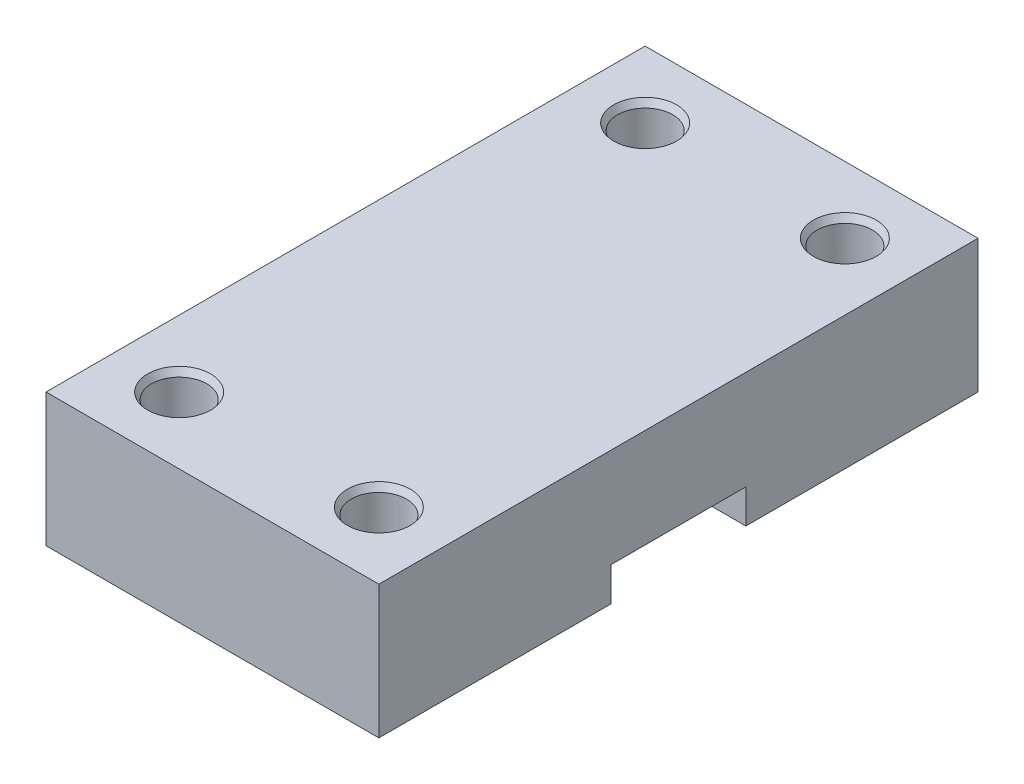
ISO-10303-21;
HEADER;
FILE_DESCRIPTION(('STEP AP214'),'2;1');
FILE_NAME('part.step','',(''),(''),'','','');
FILE_SCHEMA(('AUTOMOTIVE_DESIGN { 1 0 10303 214 1 1 1 1 }'));
ENDSEC;
DATA;
#1=APPLICATION_CONTEXT('core data for automotive mechanical design processes');
#2=APPLICATION_PROTOCOL_DEFINITION('international standard','automotive_design',2000,#1);
#3=PRODUCT_CONTEXT('',#1,'mechanical');
#4=PRODUCT('Part','Part','',(#3));
#5=PRODUCT_RELATED_PRODUCT_CATEGORY('part','',(#4));
#6=PRODUCT_DEFINITION_FORMATION('','',#4);
#7=PRODUCT_DEFINITION_CONTEXT('part definition',#1,'design');
#8=PRODUCT_DEFINITION('design','',#6,#7);
#9=PRODUCT_DEFINITION_SHAPE('','',#8);
#10=(LENGTH_UNIT() NAMED_UNIT(*) SI_UNIT(.MILLI.,.METRE.));
#11=(NAMED_UNIT(*) PLANE_ANGLE_UNIT() SI_UNIT($,.RADIAN.));
#12=(NAMED_UNIT(*) SI_UNIT($,.STERADIAN.) SOLID_ANGLE_UNIT());
#13=UNCERTAINTY_MEASURE_WITH_UNIT(LENGTH_MEASURE(1.E-05),#10,'distance_accuracy_value','');
#14=(GEOMETRIC_REPRESENTATION_CONTEXT(3) GLOBAL_UNCERTAINTY_ASSIGNED_CONTEXT((#13)) GLOBAL_UNIT_ASSIGNED_CONTEXT((#10,
#11,#12)) REPRESENTATION_CONTEXT('',''));
#15=CARTESIAN_POINT('',(0.,0.,0.));
#16=DIRECTION('',(0.,0.,1.));
#17=DIRECTION('',(1.,0.,0.));
#18=AXIS2_PLACEMENT_3D('',#15,#16,#17);
#19=CARTESIAN_POINT('',(0.,0.,0.));
#20=DIRECTION('',(0.,1.,0.));
#21=DIRECTION('',(0.,0.,1.));
#22=AXIS2_PLACEMENT_3D('',#19,#20,#21);
#23=PLANE('',#22);
#24=CARTESIAN_POINT('',(15.,0.,35.));
#25=DIRECTION('',(0.,-1.,0.));
#26=DIRECTION('',(0.,0.,-1.));
#27=AXIS2_PLACEMENT_3D('',#24,#25,#26);
#28=CIRCLE('',#27,4.15);
#29=CARTESIAN_POINT('',(15.,0.,30.85));
#30=VERTEX_POINT('',#29);
#31=EDGE_CURVE('E218',#30,#30,#28,.T.);
#32=ORIENTED_EDGE('',*,*,#31,.F.);
#33=EDGE_LOOP('',(#32));
#34=FACE_BOUND('',#33,.T.);
#35=CARTESIAN_POINT('',(-15.,0.,35.));
#36=DIRECTION('',(0.,-1.,0.));
#37=DIRECTION('',(0.,0.,-1.));
#38=AXIS2_PLACEMENT_3D('',#35,#36,#37);
#39=CIRCLE('',#38,4.15);
#40=CARTESIAN_POINT('',(-15.,0.,30.85));
#41=VERTEX_POINT('',#40);
#42=EDGE_CURVE('E130',#41,#41,#39,.T.);
#43=ORIENTED_EDGE('',*,*,#42,.F.);
#44=EDGE_LOOP('',(#43));
#45=FACE_BOUND('',#44,.T.);
#46=DIRECTION('',(0.,0.,1.));
#47=VECTOR('',#46,1.);
#48=CARTESIAN_POINT('',(-25.,0.,45.));
#49=LINE('',#48,#47);
#50=CARTESIAN_POINT('',(-25.,0.,10.125));
#51=VERTEX_POINT('',#50);
#52=CARTESIAN_POINT('',(-25.,0.,45.));
#53=VERTEX_POINT('',#52);
#54=EDGE_CURVE('E127',#51,#53,#49,.T.);
#55=ORIENTED_EDGE('',*,*,#54,.F.);
#56=DIRECTION('',(1.,0.,0.));
#57=VECTOR('',#56,1.);
#58=CARTESIAN_POINT('',(-25.,0.,10.125));
#59=LINE('',#58,#57);
#60=CARTESIAN_POINT('',(25.,0.,10.125));
#61=VERTEX_POINT('',#60);
#62=EDGE_CURVE('E109',#51,#61,#59,.T.);
#63=ORIENTED_EDGE('',*,*,#62,.T.);
#64=DIRECTION('',(0.,0.,-1.));
#65=VECTOR('',#64,1.);
#66=CARTESIAN_POINT('',(25.,0.,45.));
#67=LINE('',#66,#65);
#68=CARTESIAN_POINT('',(25.,0.,45.));
#69=VERTEX_POINT('',#68);
#70=EDGE_CURVE('E143',#69,#61,#67,.T.);
#71=ORIENTED_EDGE('',*,*,#70,.F.);
#72=DIRECTION('',(1.,0.,0.));
#73=VECTOR('',#72,1.);
#74=CARTESIAN_POINT('',(25.,0.,45.));
#75=LINE('',#74,#73);
#76=EDGE_CURVE('E132',#53,#69,#75,.T.);
#77=ORIENTED_EDGE('',*,*,#76,.F.);
#78=EDGE_LOOP('',(#55,#63,#71,#77));
#79=FACE_BOUND('',#78,.T.);
#80=ADVANCED_FACE('F34',(#34,#45,#79),#23,.F.);
#81=CARTESIAN_POINT('',(-25.,20.,45.));
#82=DIRECTION('',(1.,0.,0.));
#83=DIRECTION('',(0.,0.,-1.));
#84=AXIS2_PLACEMENT_3D('',#81,#82,#83);
#85=PLANE('',#84);
#86=DIRECTION('',(0.,0.,1.));
#87=VECTOR('',#86,1.);
#88=CARTESIAN_POINT('',(-25.,5.10000000000001,-10.125));
#89=LINE('',#88,#87);
#90=CARTESIAN_POINT('',(-25.,5.10000000000001,-10.125));
#91=VERTEX_POINT('',#90);
#92=CARTESIAN_POINT('',(-25.,5.1,10.125));
#93=VERTEX_POINT('',#92);
#94=EDGE_CURVE('E122',#91,#93,#89,.T.);
#95=ORIENTED_EDGE('',*,*,#94,.T.);
#96=DIRECTION('',(0.,-1.,0.));
#97=VECTOR('',#96,1.);
#98=CARTESIAN_POINT('',(-25.,5.1,10.125));
#99=LINE('',#98,#97);
#100=EDGE_CURVE('E113',#93,#51,#99,.T.);
#101=ORIENTED_EDGE('',*,*,#100,.T.);
#102=ORIENTED_EDGE('',*,*,#54,.T.);
#103=DIRECTION('',(0.,-1.,0.));
#104=VECTOR('',#103,1.);
#105=CARTESIAN_POINT('',(-25.,20.,45.));
#106=LINE('',#105,#104);
#107=CARTESIAN_POINT('',(-25.,20.,45.));
#108=VERTEX_POINT('',#107);
#109=EDGE_CURVE('E154',#108,#53,#106,.T.);
#110=ORIENTED_EDGE('',*,*,#109,.F.);
#111=DIRECTION('',(0.,0.,1.));
#112=VECTOR('',#111,1.);
#113=CARTESIAN_POINT('',(-25.,20.,45.));
#114=LINE('',#113,#112);
#115=CARTESIAN_POINT('',(-25.,20.,-45.));
#116=VERTEX_POINT('',#115);
#117=EDGE_CURVE('E146',#116,#108,#114,.T.);
#118=ORIENTED_EDGE('',*,*,#117,.F.);
#119=DIRECTION('',(0.,-1.,0.));
#120=VECTOR('',#119,1.);
#121=CARTESIAN_POINT('',(-25.,20.,-45.));
#122=LINE('',#121,#120);
#123=CARTESIAN_POINT('',(-25.,0.,-45.));
#124=VERTEX_POINT('',#123);
#125=EDGE_CURVE('E147',#116,#124,#122,.T.);
#126=ORIENTED_EDGE('',*,*,#125,.T.);
#127=CARTESIAN_POINT('',(-25.,0.,-10.125));
#128=VERTEX_POINT('',#127);
#129=EDGE_CURVE('E133',#124,#128,#49,.T.);
#130=ORIENTED_EDGE('',*,*,#129,.T.);
#131=DIRECTION('',(0.,1.,0.));
#132=VECTOR('',#131,1.);
#133=CARTESIAN_POINT('',(-25.,5.10000000000001,-10.125));
#134=LINE('',#133,#132);
#135=EDGE_CURVE('E49',#128,#91,#134,.T.);
#136=ORIENTED_EDGE('',*,*,#135,.T.);
#137=EDGE_LOOP('',(#95,#101,#102,#110,#118,#126,#130,#136));
#138=FACE_BOUND('',#137,.T.);
#139=ADVANCED_FACE('F125',(#138),#85,.F.);
#140=CARTESIAN_POINT('',(25.,20.,45.));
#141=DIRECTION('',(0.,0.,-1.));
#142=DIRECTION('',(-1.,0.,0.));
#143=AXIS2_PLACEMENT_3D('',#140,#141,#142);
#144=PLANE('',#143);
#145=ORIENTED_EDGE('',*,*,#76,.T.);
#146=DIRECTION('',(0.,-1.,0.));
#147=VECTOR('',#146,1.);
#148=CARTESIAN_POINT('',(25.,20.,45.));
#149=LINE('',#148,#147);
#150=CARTESIAN_POINT('',(25.,20.,45.));
#151=VERTEX_POINT('',#150);
#152=EDGE_CURVE('E151',#151,#69,#149,.T.);
#153=ORIENTED_EDGE('',*,*,#152,.F.);
#154=DIRECTION('',(1.,0.,0.));
#155=VECTOR('',#154,1.);
#156=CARTESIAN_POINT('',(25.,20.,45.));
#157=LINE('',#156,#155);
#158=EDGE_CURVE('E87',#108,#151,#157,.T.);
#159=ORIENTED_EDGE('',*,*,#158,.F.);
#160=ORIENTED_EDGE('',*,*,#109,.T.);
#161=EDGE_LOOP('',(#145,#153,#159,#160));
#162=FACE_BOUND('',#161,.T.);
#163=ADVANCED_FACE('F198',(#162),#144,.F.);
#164=CARTESIAN_POINT('',(25.,20.,45.));
#165=DIRECTION('',(-1.,0.,0.));
#166=DIRECTION('',(0.,0.,1.));
#167=AXIS2_PLACEMENT_3D('',#164,#165,#166);
#168=PLANE('',#167);
#169=ORIENTED_EDGE('',*,*,#70,.T.);
#170=DIRECTION('',(0.,1.,0.));
#171=VECTOR('',#170,1.);
#172=CARTESIAN_POINT('',(25.,20.,10.125));
#173=LINE('',#172,#171);
#174=CARTESIAN_POINT('',(25.,5.1,10.125));
#175=VERTEX_POINT('',#174);
#176=EDGE_CURVE('E116',#61,#175,#173,.T.);
#177=ORIENTED_EDGE('',*,*,#176,.T.);
#178=DIRECTION('',(0.,0.,-1.));
#179=VECTOR('',#178,1.);
#180=CARTESIAN_POINT('',(25.,5.1,45.));
#181=LINE('',#180,#179);
#182=CARTESIAN_POINT('',(25.,5.10000000000001,-10.125));
#183=VERTEX_POINT('',#182);
#184=EDGE_CURVE('E156',#175,#183,#181,.T.);
#185=ORIENTED_EDGE('',*,*,#184,.T.);
#186=DIRECTION('',(0.,-1.,0.));
#187=VECTOR('',#186,1.);
#188=CARTESIAN_POINT('',(25.,20.,-10.125));
#189=LINE('',#188,#187);
#190=CARTESIAN_POINT('',(25.,0.,-10.125));
#191=VERTEX_POINT('',#190);
#192=EDGE_CURVE('E136',#183,#191,#189,.T.);
#193=ORIENTED_EDGE('',*,*,#192,.T.);
#194=CARTESIAN_POINT('',(25.,0.,-45.));
#195=VERTEX_POINT('',#194);
#196=EDGE_CURVE('E142',#191,#195,#67,.T.);
#197=ORIENTED_EDGE('',*,*,#196,.T.);
#198=DIRECTION('',(0.,-1.,0.));
#199=VECTOR('',#198,1.);
#200=CARTESIAN_POINT('',(25.,20.,-45.));
#201=LINE('',#200,#199);
#202=CARTESIAN_POINT('',(25.,20.,-45.));
#203=VERTEX_POINT('',#202);
#204=EDGE_CURVE('E149',#203,#195,#201,.T.);
#205=ORIENTED_EDGE('',*,*,#204,.F.);
#206=DIRECTION('',(0.,0.,-1.));
#207=VECTOR('',#206,1.);
#208=CARTESIAN_POINT('',(25.,20.,45.));
#209=LINE('',#208,#207);
#210=EDGE_CURVE('E203',#151,#203,#209,.T.);
#211=ORIENTED_EDGE('',*,*,#210,.F.);
#212=ORIENTED_EDGE('',*,*,#152,.T.);
#213=EDGE_LOOP('',(#169,#177,#185,#193,#197,#205,#211,#212));
#214=FACE_BOUND('',#213,.T.);
#215=ADVANCED_FACE('F201',(#214),#168,.F.);
#216=CARTESIAN_POINT('',(25.,20.,-45.));
#217=DIRECTION('',(0.,0.,1.));
#218=DIRECTION('',(1.,0.,0.));
#219=AXIS2_PLACEMENT_3D('',#216,#217,#218);
#220=PLANE('',#219);
#221=DIRECTION('',(-1.,0.,0.));
#222=VECTOR('',#221,1.);
#223=CARTESIAN_POINT('',(25.,0.,-45.));
#224=LINE('',#223,#222);
#225=EDGE_CURVE('E79',#195,#124,#224,.T.);
#226=ORIENTED_EDGE('',*,*,#225,.T.);
#227=ORIENTED_EDGE('',*,*,#125,.F.);
#228=DIRECTION('',(-1.,0.,0.));
#229=VECTOR('',#228,1.);
#230=CARTESIAN_POINT('',(25.,20.,-45.));
#231=LINE('',#230,#229);
#232=EDGE_CURVE('E58',#203,#116,#231,.T.);
#233=ORIENTED_EDGE('',*,*,#232,.F.);
#234=ORIENTED_EDGE('',*,*,#204,.T.);
#235=EDGE_LOOP('',(#226,#227,#233,#234));
#236=FACE_BOUND('',#235,.T.);
#237=ADVANCED_FACE('F192',(#236),#220,.F.);
#238=CARTESIAN_POINT('',(0.,20.,0.));
#239=DIRECTION('',(0.,1.,0.));
#240=DIRECTION('',(0.,0.,1.));
#241=AXIS2_PLACEMENT_3D('',#238,#239,#240);
#242=PLANE('',#241);
#243=CARTESIAN_POINT('',(15.,20.,-35.));
#244=DIRECTION('',(0.,1.,0.));
#245=DIRECTION('',(0.,0.,1.));
#246=AXIS2_PLACEMENT_3D('',#243,#244,#245);
#247=CIRCLE('',#246,4.72735026918963);
#248=CARTESIAN_POINT('',(15.,20.,-30.2726497308104));
#249=VERTEX_POINT('',#248);
#250=EDGE_CURVE('E168',#249,#249,#247,.F.);
#251=ORIENTED_EDGE('',*,*,#250,.T.);
#252=EDGE_LOOP('',(#251));
#253=FACE_BOUND('',#252,.T.);
#254=CARTESIAN_POINT('',(15.,20.,35.));
#255=DIRECTION('',(0.,1.,0.));
#256=DIRECTION('',(0.,0.,1.));
#257=AXIS2_PLACEMENT_3D('',#254,#255,#256);
#258=CIRCLE('',#257,4.72735026918963);
#259=CARTESIAN_POINT('',(15.,20.,39.7273502691896));
#260=VERTEX_POINT('',#259);
#261=EDGE_CURVE('E165',#260,#260,#258,.F.);
#262=ORIENTED_EDGE('',*,*,#261,.T.);
#263=EDGE_LOOP('',(#262));
#264=FACE_BOUND('',#263,.T.);
#265=CARTESIAN_POINT('',(-15.,20.,35.));
#266=DIRECTION('',(0.,1.,0.));
#267=DIRECTION('',(0.,0.,1.));
#268=AXIS2_PLACEMENT_3D('',#265,#266,#267);
#269=CIRCLE('',#268,4.72735026918963);
#270=CARTESIAN_POINT('',(-15.,20.,39.7273502691896));
#271=VERTEX_POINT('',#270);
#272=EDGE_CURVE('E162',#271,#271,#269,.F.);
#273=ORIENTED_EDGE('',*,*,#272,.T.);
#274=EDGE_LOOP('',(#273));
#275=FACE_BOUND('',#274,.T.);
#276=CARTESIAN_POINT('',(-15.,20.,-35.));
#277=DIRECTION('',(0.,1.,0.));
#278=DIRECTION('',(0.,0.,1.));
#279=AXIS2_PLACEMENT_3D('',#276,#277,#278);
#280=CIRCLE('',#279,4.72735026918963);
#281=CARTESIAN_POINT('',(-15.,20.,-30.2726497308104));
#282=VERTEX_POINT('',#281);
#283=EDGE_CURVE('E159',#282,#282,#280,.F.);
#284=ORIENTED_EDGE('',*,*,#283,.T.);
#285=EDGE_LOOP('',(#284));
#286=FACE_BOUND('',#285,.T.);
#287=ORIENTED_EDGE('',*,*,#117,.T.);
#288=ORIENTED_EDGE('',*,*,#158,.T.);
#289=ORIENTED_EDGE('',*,*,#210,.T.);
#290=ORIENTED_EDGE('',*,*,#232,.T.);
#291=EDGE_LOOP('',(#287,#288,#289,#290));
#292=FACE_BOUND('',#291,.T.);
#293=ADVANCED_FACE('F188',(#253,#264,#275,#286,#292),#242,.T.);
#294=CARTESIAN_POINT('',(15.,0.,-35.));
#295=DIRECTION('',(0.,-1.,0.));
#296=DIRECTION('',(0.,0.,-1.));
#297=AXIS2_PLACEMENT_3D('',#294,#295,#296);
#298=CIRCLE('',#297,4.15);
#299=CARTESIAN_POINT('',(15.,0.,-39.15));
#300=VERTEX_POINT('',#299);
#301=EDGE_CURVE('E222',#300,#300,#298,.T.);
#302=ORIENTED_EDGE('',*,*,#301,.F.);
#303=EDGE_LOOP('',(#302));
#304=FACE_BOUND('',#303,.T.);
#305=CARTESIAN_POINT('',(-15.,0.,-35.));
#306=DIRECTION('',(0.,-1.,0.));
#307=DIRECTION('',(0.,0.,-1.));
#308=AXIS2_PLACEMENT_3D('',#305,#306,#307);
#309=CIRCLE('',#308,4.15);
#310=CARTESIAN_POINT('',(-15.,0.,-39.15));
#311=VERTEX_POINT('',#310);
#312=EDGE_CURVE('E219',#311,#311,#309,.T.);
#313=ORIENTED_EDGE('',*,*,#312,.F.);
#314=EDGE_LOOP('',(#313));
#315=FACE_BOUND('',#314,.T.);
#316=ORIENTED_EDGE('',*,*,#196,.F.);
#317=DIRECTION('',(1.,0.,0.));
#318=VECTOR('',#317,1.);
#319=CARTESIAN_POINT('',(-25.,0.,-10.125));
#320=LINE('',#319,#318);
#321=EDGE_CURVE('E121',#128,#191,#320,.T.);
#322=ORIENTED_EDGE('',*,*,#321,.F.);
#323=ORIENTED_EDGE('',*,*,#129,.F.);
#324=ORIENTED_EDGE('',*,*,#225,.F.);
#325=EDGE_LOOP('',(#316,#322,#323,#324));
#326=FACE_BOUND('',#325,.T.);
#327=ADVANCED_FACE('F191',(#304,#315,#326),#23,.F.);
#328=CARTESIAN_POINT('',(-25.,5.10000000000001,-10.125));
#329=DIRECTION('',(0.,1.,0.));
#330=DIRECTION('',(0.,0.,1.));
#331=AXIS2_PLACEMENT_3D('',#328,#329,#330);
#332=PLANE('',#331);
#333=DIRECTION('',(1.,0.,0.));
#334=VECTOR('',#333,1.);
#335=CARTESIAN_POINT('',(-25.,5.1,10.125));
#336=LINE('',#335,#334);
#337=EDGE_CURVE('E207',#93,#175,#336,.T.);
#338=ORIENTED_EDGE('',*,*,#337,.F.);
#339=ORIENTED_EDGE('',*,*,#94,.F.);
#340=DIRECTION('',(1.,0.,0.));
#341=VECTOR('',#340,1.);
#342=CARTESIAN_POINT('',(-25.,5.10000000000001,-10.125));
#343=LINE('',#342,#341);
#344=EDGE_CURVE('E210',#91,#183,#343,.T.);
#345=ORIENTED_EDGE('',*,*,#344,.T.);
#346=ORIENTED_EDGE('',*,*,#184,.F.);
#347=EDGE_LOOP('',(#338,#339,#345,#346));
#348=FACE_BOUND('',#347,.T.);
#349=ADVANCED_FACE('F248',(#348),#332,.F.);
#350=CARTESIAN_POINT('',(-25.,5.1,10.125));
#351=DIRECTION('',(0.,0.,1.));
#352=DIRECTION('',(1.,0.,0.));
#353=AXIS2_PLACEMENT_3D('',#350,#351,#352);
#354=PLANE('',#353);
#355=ORIENTED_EDGE('',*,*,#62,.F.);
#356=ORIENTED_EDGE('',*,*,#100,.F.);
#357=ORIENTED_EDGE('',*,*,#337,.T.);
#358=ORIENTED_EDGE('',*,*,#176,.F.);
#359=EDGE_LOOP('',(#355,#356,#357,#358));
#360=FACE_BOUND('',#359,.T.);
#361=ADVANCED_FACE('F111',(#360),#354,.F.);
#362=CARTESIAN_POINT('',(-25.,5.10000000000001,-10.125));
#363=DIRECTION('',(0.,0.,-1.));
#364=DIRECTION('',(0.,1.,0.));
#365=AXIS2_PLACEMENT_3D('',#362,#363,#364);
#366=PLANE('',#365);
#367=ORIENTED_EDGE('',*,*,#344,.F.);
#368=ORIENTED_EDGE('',*,*,#135,.F.);
#369=ORIENTED_EDGE('',*,*,#321,.T.);
#370=ORIENTED_EDGE('',*,*,#192,.F.);
#371=EDGE_LOOP('',(#367,#368,#369,#370));
#372=FACE_BOUND('',#371,.T.);
#373=ADVANCED_FACE('F236',(#372),#366,.F.);
#374=CARTESIAN_POINT('',(-15.,20.,35.));
#375=DIRECTION('',(0.,-1.,0.));
#376=DIRECTION('',(0.,0.,-1.));
#377=AXIS2_PLACEMENT_3D('',#374,#375,#376);
#378=CYLINDRICAL_SURFACE('',#377,4.15);
#379=CARTESIAN_POINT('',(-15.,19.,35.));
#380=DIRECTION('',(0.,1.,0.));
#381=DIRECTION('',(0.,0.,1.));
#382=AXIS2_PLACEMENT_3D('',#379,#380,#381);
#383=CIRCLE('',#382,4.15);
#384=CARTESIAN_POINT('',(-15.,19.,39.15));
#385=VERTEX_POINT('',#384);
#386=EDGE_CURVE('E42',#385,#385,#383,.T.);
#387=ORIENTED_EDGE('',*,*,#386,.T.);
#388=EDGE_LOOP('',(#387));
#389=FACE_BOUND('',#388,.T.);
#390=ORIENTED_EDGE('',*,*,#42,.T.);
#391=EDGE_LOOP('',(#390));
#392=FACE_BOUND('',#391,.T.);
#393=ADVANCED_FACE('F179',(#389,#392),#378,.F.);
#394=CARTESIAN_POINT('',(-15.,20.,-35.));
#395=DIRECTION('',(0.,-1.,0.));
#396=DIRECTION('',(0.,0.,-1.));
#397=AXIS2_PLACEMENT_3D('',#394,#395,#396);
#398=CYLINDRICAL_SURFACE('',#397,4.15);
#399=CARTESIAN_POINT('',(-15.,19.,-35.));
#400=DIRECTION('',(0.,1.,0.));
#401=DIRECTION('',(0.,0.,1.));
#402=AXIS2_PLACEMENT_3D('',#399,#400,#401);
#403=CIRCLE('',#402,4.15);
#404=CARTESIAN_POINT('',(-15.,19.,-30.85));
#405=VERTEX_POINT('',#404);
#406=EDGE_CURVE('E11',#405,#405,#403,.T.);
#407=ORIENTED_EDGE('',*,*,#406,.T.);
#408=EDGE_LOOP('',(#407));
#409=FACE_BOUND('',#408,.T.);
#410=ORIENTED_EDGE('',*,*,#312,.T.);
#411=EDGE_LOOP('',(#410));
#412=FACE_BOUND('',#411,.T.);
#413=ADVANCED_FACE('F235',(#409,#412),#398,.F.);
#414=CARTESIAN_POINT('',(15.,20.,-35.));
#415=DIRECTION('',(0.,-1.,0.));
#416=DIRECTION('',(0.,0.,-1.));
#417=AXIS2_PLACEMENT_3D('',#414,#415,#416);
#418=CYLINDRICAL_SURFACE('',#417,4.15);
#419=CARTESIAN_POINT('',(15.,19.,-35.));
#420=DIRECTION('',(0.,1.,0.));
#421=DIRECTION('',(0.,0.,1.));
#422=AXIS2_PLACEMENT_3D('',#419,#420,#421);
#423=CIRCLE('',#422,4.15);
#424=CARTESIAN_POINT('',(15.,19.,-30.85));
#425=VERTEX_POINT('',#424);
#426=EDGE_CURVE('E171',#425,#425,#423,.T.);
#427=ORIENTED_EDGE('',*,*,#426,.T.);
#428=EDGE_LOOP('',(#427));
#429=FACE_BOUND('',#428,.T.);
#430=ORIENTED_EDGE('',*,*,#301,.T.);
#431=EDGE_LOOP('',(#430));
#432=FACE_BOUND('',#431,.T.);
#433=ADVANCED_FACE('F242',(#429,#432),#418,.F.);
#434=CARTESIAN_POINT('',(15.,20.,35.));
#435=DIRECTION('',(0.,-1.,0.));
#436=DIRECTION('',(0.,0.,-1.));
#437=AXIS2_PLACEMENT_3D('',#434,#435,#436);
#438=CYLINDRICAL_SURFACE('',#437,4.15);
#439=CARTESIAN_POINT('',(15.,19.,35.));
#440=DIRECTION('',(0.,1.,0.));
#441=DIRECTION('',(0.,0.,1.));
#442=AXIS2_PLACEMENT_3D('',#439,#440,#441);
#443=CIRCLE('',#442,4.15);
#444=CARTESIAN_POINT('',(15.,19.,39.15));
#445=VERTEX_POINT('',#444);
#446=EDGE_CURVE('E174',#445,#445,#443,.T.);
#447=ORIENTED_EDGE('',*,*,#446,.T.);
#448=EDGE_LOOP('',(#447));
#449=FACE_BOUND('',#448,.T.);
#450=ORIENTED_EDGE('',*,*,#31,.T.);
#451=EDGE_LOOP('',(#450));
#452=FACE_BOUND('',#451,.T.);
#453=ADVANCED_FACE('F228',(#449,#452),#438,.F.);
#454=CARTESIAN_POINT('',(15.,20.,-35.));
#455=DIRECTION('',(0.,1.,0.));
#456=DIRECTION('',(0.,0.,1.));
#457=AXIS2_PLACEMENT_3D('',#454,#455,#456);
#458=CONICAL_SURFACE('',#457,4.72735026918963,0.523598775598292);
#459=ORIENTED_EDGE('',*,*,#426,.F.);
#460=EDGE_LOOP('',(#459));
#461=FACE_BOUND('',#460,.T.);
#462=ORIENTED_EDGE('',*,*,#250,.F.);
#463=EDGE_LOOP('',(#462));
#464=FACE_BOUND('',#463,.T.);
#465=ADVANCED_FACE('F264',(#461,#464),#458,.F.);
#466=CARTESIAN_POINT('',(15.,20.,35.));
#467=DIRECTION('',(0.,1.,0.));
#468=DIRECTION('',(0.,0.,1.));
#469=AXIS2_PLACEMENT_3D('',#466,#467,#468);
#470=CONICAL_SURFACE('',#469,4.72735026918963,0.523598775598292);
#471=ORIENTED_EDGE('',*,*,#446,.F.);
#472=EDGE_LOOP('',(#471));
#473=FACE_BOUND('',#472,.T.);
#474=ORIENTED_EDGE('',*,*,#261,.F.);
#475=EDGE_LOOP('',(#474));
#476=FACE_BOUND('',#475,.T.);
#477=ADVANCED_FACE('F185',(#473,#476),#470,.F.);
#478=CARTESIAN_POINT('',(-15.,20.,35.));
#479=DIRECTION('',(0.,1.,0.));
#480=DIRECTION('',(0.,0.,1.));
#481=AXIS2_PLACEMENT_3D('',#478,#479,#480);
#482=CONICAL_SURFACE('',#481,4.72735026918963,0.523598775598292);
#483=ORIENTED_EDGE('',*,*,#386,.F.);
#484=EDGE_LOOP('',(#483));
#485=FACE_BOUND('',#484,.T.);
#486=ORIENTED_EDGE('',*,*,#272,.F.);
#487=EDGE_LOOP('',(#486));
#488=FACE_BOUND('',#487,.T.);
#489=ADVANCED_FACE('F182',(#485,#488),#482,.F.);
#490=CARTESIAN_POINT('',(-15.,20.,-35.));
#491=DIRECTION('',(0.,1.,0.));
#492=DIRECTION('',(0.,0.,1.));
#493=AXIS2_PLACEMENT_3D('',#490,#491,#492);
#494=CONICAL_SURFACE('',#493,4.72735026918963,0.523598775598292);
#495=ORIENTED_EDGE('',*,*,#406,.F.);
#496=EDGE_LOOP('',(#495));
#497=FACE_BOUND('',#496,.T.);
#498=ORIENTED_EDGE('',*,*,#283,.F.);
#499=EDGE_LOOP('',(#498));
#500=FACE_BOUND('',#499,.T.);
#501=ADVANCED_FACE('F36',(#497,#500),#494,.F.);
#502=CLOSED_SHELL('',(#80,#139,#163,#215,#237,#293,#327,#349,#361,#373,#393,#413,#433,#453,#465,
#477,#489,#501));
#503=MANIFOLD_SOLID_BREP('B2',#502);
#504=ADVANCED_BREP_SHAPE_REPRESENTATION('',(#18,#503),#14);
#505=SHAPE_DEFINITION_REPRESENTATION(#9,#504);
ENDSEC;
END-ISO-10303-21;
